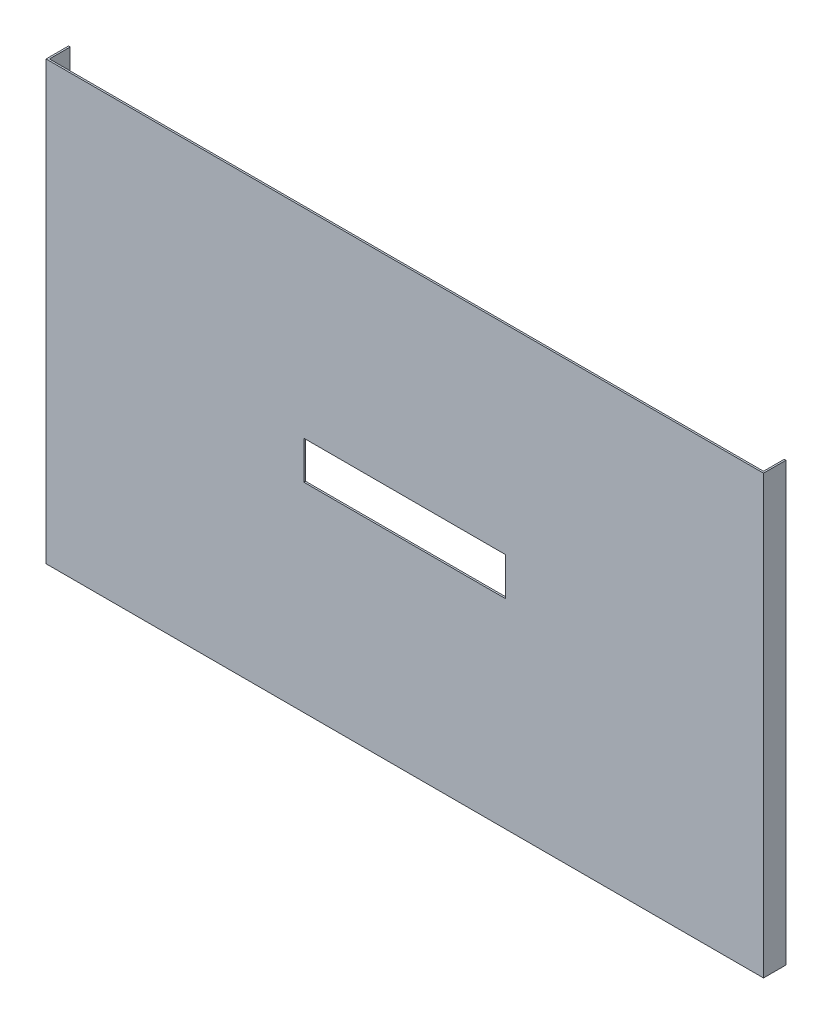
ISO-10303-21;
HEADER;
FILE_DESCRIPTION(('STEP AP214'),'2;1');
FILE_NAME('part.step','',(''),(''),'','','');
FILE_SCHEMA(('AUTOMOTIVE_DESIGN { 1 0 10303 214 1 1 1 1 }'));
ENDSEC;
DATA;
#1=APPLICATION_CONTEXT('core data for automotive mechanical design processes');
#2=APPLICATION_PROTOCOL_DEFINITION('international standard','automotive_design',2000,#1);
#3=PRODUCT_CONTEXT('',#1,'mechanical');
#4=PRODUCT('Part','Part','',(#3));
#5=PRODUCT_RELATED_PRODUCT_CATEGORY('part','',(#4));
#6=PRODUCT_DEFINITION_FORMATION('','',#4);
#7=PRODUCT_DEFINITION_CONTEXT('part definition',#1,'design');
#8=PRODUCT_DEFINITION('design','',#6,#7);
#9=PRODUCT_DEFINITION_SHAPE('','',#8);
#10=(LENGTH_UNIT() NAMED_UNIT(*) SI_UNIT(.MILLI.,.METRE.));
#11=(NAMED_UNIT(*) PLANE_ANGLE_UNIT() SI_UNIT($,.RADIAN.));
#12=(NAMED_UNIT(*) SI_UNIT($,.STERADIAN.) SOLID_ANGLE_UNIT());
#13=UNCERTAINTY_MEASURE_WITH_UNIT(LENGTH_MEASURE(1.E-05),#10,'distance_accuracy_value','');
#14=(GEOMETRIC_REPRESENTATION_CONTEXT(3) GLOBAL_UNCERTAINTY_ASSIGNED_CONTEXT((#13)) GLOBAL_UNIT_ASSIGNED_CONTEXT((#10,
#11,#12)) REPRESENTATION_CONTEXT('',''));
#15=CARTESIAN_POINT('',(0.,0.,0.));
#16=DIRECTION('',(0.,0.,1.));
#17=DIRECTION('',(1.,0.,0.));
#18=AXIS2_PLACEMENT_3D('',#15,#16,#17);
#19=CARTESIAN_POINT('',(670.,1950.,40.));
#20=DIRECTION('',(0.,0.,-1.));
#21=DIRECTION('',(-1.,0.,0.));
#22=AXIS2_PLACEMENT_3D('',#19,#20,#21);
#23=PLANE('',#22);
#24=DIRECTION('',(1.,0.,0.));
#25=VECTOR('',#24,1.);
#26=CARTESIAN_POINT('',(670.,1560.,40.));
#27=LINE('',#26,#25);
#28=CARTESIAN_POINT('',(30.,1560.,40.));
#29=VERTEX_POINT('',#28);
#30=CARTESIAN_POINT('',(670.,1560.,40.));
#31=VERTEX_POINT('',#30);
#32=EDGE_CURVE('E141',#29,#31,#27,.T.);
#33=ORIENTED_EDGE('',*,*,#32,.T.);
#34=DIRECTION('',(0.,-1.,0.));
#35=VECTOR('',#34,1.);
#36=CARTESIAN_POINT('',(670.,1950.,40.));
#37=LINE('',#36,#35);
#38=CARTESIAN_POINT('',(670.,1950.,40.));
#39=VERTEX_POINT('',#38);
#40=EDGE_CURVE('E200',#39,#31,#37,.T.);
#41=ORIENTED_EDGE('',*,*,#40,.F.);
#42=DIRECTION('',(1.,0.,0.));
#43=VECTOR('',#42,1.);
#44=CARTESIAN_POINT('',(670.,1950.,40.));
#45=LINE('',#44,#43);
#46=CARTESIAN_POINT('',(30.,1950.,40.));
#47=VERTEX_POINT('',#46);
#48=EDGE_CURVE('E149',#47,#39,#45,.T.);
#49=ORIENTED_EDGE('',*,*,#48,.F.);
#50=DIRECTION('',(0.,-1.,0.));
#51=VECTOR('',#50,1.);
#52=CARTESIAN_POINT('',(30.,1950.,40.));
#53=LINE('',#52,#51);
#54=EDGE_CURVE('E166',#47,#29,#53,.T.);
#55=ORIENTED_EDGE('',*,*,#54,.T.);
#56=EDGE_LOOP('',(#33,#41,#49,#55));
#57=FACE_BOUND('',#56,.T.);
#58=DIRECTION('',(0.,-1.,0.));
#59=VECTOR('',#58,1.);
#60=CARTESIAN_POINT('',(260.,1950.,40.));
#61=LINE('',#60,#59);
#62=CARTESIAN_POINT('',(260.,1772.,40.));
#63=VERTEX_POINT('',#62);
#64=CARTESIAN_POINT('',(260.,1738.,40.));
#65=VERTEX_POINT('',#64);
#66=EDGE_CURVE('E134',#63,#65,#61,.T.);
#67=ORIENTED_EDGE('',*,*,#66,.F.);
#68=DIRECTION('',(-1.,0.,0.));
#69=VECTOR('',#68,1.);
#70=CARTESIAN_POINT('',(670.,1772.,40.));
#71=LINE('',#70,#69);
#72=CARTESIAN_POINT('',(440.,1772.,40.));
#73=VERTEX_POINT('',#72);
#74=EDGE_CURVE('E123',#73,#63,#71,.T.);
#75=ORIENTED_EDGE('',*,*,#74,.F.);
#76=DIRECTION('',(0.,1.,0.));
#77=VECTOR('',#76,1.);
#78=CARTESIAN_POINT('',(440.,1950.,40.));
#79=LINE('',#78,#77);
#80=CARTESIAN_POINT('',(440.,1738.,40.));
#81=VERTEX_POINT('',#80);
#82=EDGE_CURVE('E128',#81,#73,#79,.T.);
#83=ORIENTED_EDGE('',*,*,#82,.F.);
#84=DIRECTION('',(1.,0.,0.));
#85=VECTOR('',#84,1.);
#86=CARTESIAN_POINT('',(670.,1738.,40.));
#87=LINE('',#86,#85);
#88=EDGE_CURVE('E140',#65,#81,#87,.T.);
#89=ORIENTED_EDGE('',*,*,#88,.F.);
#90=EDGE_LOOP('',(#67,#75,#83,#89));
#91=FACE_BOUND('',#90,.T.);
#92=ADVANCED_FACE('F39',(#57,#91),#23,.F.);
#93=CARTESIAN_POINT('',(31.5,1950.,38.5));
#94=DIRECTION('',(0.,0.,1.));
#95=DIRECTION('',(1.,0.,0.));
#96=AXIS2_PLACEMENT_3D('',#93,#94,#95);
#97=PLANE('',#96);
#98=DIRECTION('',(-1.,0.,0.));
#99=VECTOR('',#98,1.);
#100=CARTESIAN_POINT('',(31.5,1560.,38.5));
#101=LINE('',#100,#99);
#102=CARTESIAN_POINT('',(668.5,1560.,38.5));
#103=VERTEX_POINT('',#102);
#104=CARTESIAN_POINT('',(31.5,1560.,38.5));
#105=VERTEX_POINT('',#104);
#106=EDGE_CURVE('E173',#103,#105,#101,.T.);
#107=ORIENTED_EDGE('',*,*,#106,.T.);
#108=DIRECTION('',(0.,-1.,0.));
#109=VECTOR('',#108,1.);
#110=CARTESIAN_POINT('',(31.5,1950.,38.5));
#111=LINE('',#110,#109);
#112=CARTESIAN_POINT('',(31.5,1950.,38.5));
#113=VERTEX_POINT('',#112);
#114=EDGE_CURVE('E188',#113,#105,#111,.T.);
#115=ORIENTED_EDGE('',*,*,#114,.F.);
#116=DIRECTION('',(-1.,0.,0.));
#117=VECTOR('',#116,1.);
#118=CARTESIAN_POINT('',(31.5,1950.,38.5));
#119=LINE('',#118,#117);
#120=CARTESIAN_POINT('',(668.5,1950.,38.5));
#121=VERTEX_POINT('',#120);
#122=EDGE_CURVE('E159',#121,#113,#119,.T.);
#123=ORIENTED_EDGE('',*,*,#122,.F.);
#124=DIRECTION('',(0.,-1.,0.));
#125=VECTOR('',#124,1.);
#126=CARTESIAN_POINT('',(668.5,1950.,38.5));
#127=LINE('',#126,#125);
#128=EDGE_CURVE('E191',#121,#103,#127,.T.);
#129=ORIENTED_EDGE('',*,*,#128,.T.);
#130=EDGE_LOOP('',(#107,#115,#123,#129));
#131=FACE_BOUND('',#130,.T.);
#132=DIRECTION('',(0.,1.,0.));
#133=VECTOR('',#132,1.);
#134=CARTESIAN_POINT('',(260.,1950.,38.5));
#135=LINE('',#134,#133);
#136=CARTESIAN_POINT('',(260.,1738.,38.5));
#137=VERTEX_POINT('',#136);
#138=CARTESIAN_POINT('',(260.,1772.,38.5));
#139=VERTEX_POINT('',#138);
#140=EDGE_CURVE('E11',#137,#139,#135,.T.);
#141=ORIENTED_EDGE('',*,*,#140,.F.);
#142=DIRECTION('',(-1.,0.,0.));
#143=VECTOR('',#142,1.);
#144=CARTESIAN_POINT('',(31.5,1738.,38.5));
#145=LINE('',#144,#143);
#146=CARTESIAN_POINT('',(440.,1738.,38.5));
#147=VERTEX_POINT('',#146);
#148=EDGE_CURVE('E46',#147,#137,#145,.T.);
#149=ORIENTED_EDGE('',*,*,#148,.F.);
#150=DIRECTION('',(0.,-1.,0.));
#151=VECTOR('',#150,1.);
#152=CARTESIAN_POINT('',(440.,1950.,38.5));
#153=LINE('',#152,#151);
#154=CARTESIAN_POINT('',(440.,1772.,38.5));
#155=VERTEX_POINT('',#154);
#156=EDGE_CURVE('E205',#155,#147,#153,.T.);
#157=ORIENTED_EDGE('',*,*,#156,.F.);
#158=DIRECTION('',(1.,0.,0.));
#159=VECTOR('',#158,1.);
#160=CARTESIAN_POINT('',(31.5,1772.,38.5));
#161=LINE('',#160,#159);
#162=EDGE_CURVE('E203',#139,#155,#161,.T.);
#163=ORIENTED_EDGE('',*,*,#162,.F.);
#164=EDGE_LOOP('',(#141,#149,#157,#163));
#165=FACE_BOUND('',#164,.T.);
#166=ADVANCED_FACE('F215',(#131,#165),#97,.F.);
#167=CARTESIAN_POINT('',(670.,1950.,20.));
#168=DIRECTION('',(-1.,0.,0.));
#169=DIRECTION('',(0.,0.,1.));
#170=AXIS2_PLACEMENT_3D('',#167,#168,#169);
#171=PLANE('',#170);
#172=DIRECTION('',(0.,0.,-1.));
#173=VECTOR('',#172,1.);
#174=CARTESIAN_POINT('',(670.,1560.,20.));
#175=LINE('',#174,#173);
#176=CARTESIAN_POINT('',(670.,1560.,20.));
#177=VERTEX_POINT('',#176);
#178=EDGE_CURVE('E144',#31,#177,#175,.T.);
#179=ORIENTED_EDGE('',*,*,#178,.T.);
#180=DIRECTION('',(0.,-1.,0.));
#181=VECTOR('',#180,1.);
#182=CARTESIAN_POINT('',(670.,1950.,20.));
#183=LINE('',#182,#181);
#184=CARTESIAN_POINT('',(670.,1950.,20.));
#185=VERTEX_POINT('',#184);
#186=EDGE_CURVE('E197',#185,#177,#183,.T.);
#187=ORIENTED_EDGE('',*,*,#186,.F.);
#188=DIRECTION('',(0.,0.,-1.));
#189=VECTOR('',#188,1.);
#190=CARTESIAN_POINT('',(670.,1950.,20.));
#191=LINE('',#190,#189);
#192=EDGE_CURVE('E152',#39,#185,#191,.T.);
#193=ORIENTED_EDGE('',*,*,#192,.F.);
#194=ORIENTED_EDGE('',*,*,#40,.T.);
#195=EDGE_LOOP('',(#179,#187,#193,#194));
#196=FACE_BOUND('',#195,.T.);
#197=ADVANCED_FACE('F234',(#196),#171,.F.);
#198=CARTESIAN_POINT('',(668.5,1950.,20.));
#199=DIRECTION('',(0.,0.,1.));
#200=DIRECTION('',(1.,0.,0.));
#201=AXIS2_PLACEMENT_3D('',#198,#199,#200);
#202=PLANE('',#201);
#203=DIRECTION('',(-1.,0.,0.));
#204=VECTOR('',#203,1.);
#205=CARTESIAN_POINT('',(668.5,1560.,20.));
#206=LINE('',#205,#204);
#207=CARTESIAN_POINT('',(668.5,1560.,20.));
#208=VERTEX_POINT('',#207);
#209=EDGE_CURVE('E169',#177,#208,#206,.T.);
#210=ORIENTED_EDGE('',*,*,#209,.T.);
#211=DIRECTION('',(0.,-1.,0.));
#212=VECTOR('',#211,1.);
#213=CARTESIAN_POINT('',(668.5,1950.,20.));
#214=LINE('',#213,#212);
#215=CARTESIAN_POINT('',(668.5,1950.,20.));
#216=VERTEX_POINT('',#215);
#217=EDGE_CURVE('E194',#216,#208,#214,.T.);
#218=ORIENTED_EDGE('',*,*,#217,.F.);
#219=DIRECTION('',(-1.,0.,0.));
#220=VECTOR('',#219,1.);
#221=CARTESIAN_POINT('',(668.5,1950.,20.));
#222=LINE('',#221,#220);
#223=EDGE_CURVE('E155',#185,#216,#222,.T.);
#224=ORIENTED_EDGE('',*,*,#223,.F.);
#225=ORIENTED_EDGE('',*,*,#186,.T.);
#226=EDGE_LOOP('',(#210,#218,#224,#225));
#227=FACE_BOUND('',#226,.T.);
#228=ADVANCED_FACE('F273',(#227),#202,.F.);
#229=CARTESIAN_POINT('',(668.5,1950.,38.5));
#230=DIRECTION('',(1.,0.,0.));
#231=DIRECTION('',(0.,0.,-1.));
#232=AXIS2_PLACEMENT_3D('',#229,#230,#231);
#233=PLANE('',#232);
#234=DIRECTION('',(0.,0.,1.));
#235=VECTOR('',#234,1.);
#236=CARTESIAN_POINT('',(668.5,1560.,38.5));
#237=LINE('',#236,#235);
#238=EDGE_CURVE('E171',#208,#103,#237,.T.);
#239=ORIENTED_EDGE('',*,*,#238,.T.);
#240=ORIENTED_EDGE('',*,*,#128,.F.);
#241=DIRECTION('',(0.,0.,1.));
#242=VECTOR('',#241,1.);
#243=CARTESIAN_POINT('',(668.5,1950.,38.5));
#244=LINE('',#243,#242);
#245=EDGE_CURVE('E157',#216,#121,#244,.T.);
#246=ORIENTED_EDGE('',*,*,#245,.F.);
#247=ORIENTED_EDGE('',*,*,#217,.T.);
#248=EDGE_LOOP('',(#239,#240,#246,#247));
#249=FACE_BOUND('',#248,.T.);
#250=ADVANCED_FACE('F270',(#249),#233,.F.);
#251=CARTESIAN_POINT('',(31.5,1950.,20.));
#252=DIRECTION('',(-1.,0.,0.));
#253=DIRECTION('',(0.,0.,1.));
#254=AXIS2_PLACEMENT_3D('',#251,#252,#253);
#255=PLANE('',#254);
#256=DIRECTION('',(0.,0.,-1.));
#257=VECTOR('',#256,1.);
#258=CARTESIAN_POINT('',(31.5,1560.,20.));
#259=LINE('',#258,#257);
#260=CARTESIAN_POINT('',(31.5,1560.,20.));
#261=VERTEX_POINT('',#260);
#262=EDGE_CURVE('E175',#105,#261,#259,.T.);
#263=ORIENTED_EDGE('',*,*,#262,.T.);
#264=DIRECTION('',(0.,-1.,0.));
#265=VECTOR('',#264,1.);
#266=CARTESIAN_POINT('',(31.5,1950.,20.));
#267=LINE('',#266,#265);
#268=CARTESIAN_POINT('',(31.5,1950.,20.));
#269=VERTEX_POINT('',#268);
#270=EDGE_CURVE('E185',#269,#261,#267,.T.);
#271=ORIENTED_EDGE('',*,*,#270,.F.);
#272=DIRECTION('',(0.,0.,-1.));
#273=VECTOR('',#272,1.);
#274=CARTESIAN_POINT('',(31.5,1950.,20.));
#275=LINE('',#274,#273);
#276=EDGE_CURVE('E161',#113,#269,#275,.T.);
#277=ORIENTED_EDGE('',*,*,#276,.F.);
#278=ORIENTED_EDGE('',*,*,#114,.T.);
#279=EDGE_LOOP('',(#263,#271,#277,#278));
#280=FACE_BOUND('',#279,.T.);
#281=ADVANCED_FACE('F263',(#280),#255,.F.);
#282=CARTESIAN_POINT('',(30.,1950.,20.));
#283=DIRECTION('',(0.,0.,1.));
#284=DIRECTION('',(1.,0.,0.));
#285=AXIS2_PLACEMENT_3D('',#282,#283,#284);
#286=PLANE('',#285);
#287=DIRECTION('',(-1.,0.,0.));
#288=VECTOR('',#287,1.);
#289=CARTESIAN_POINT('',(30.,1560.,20.));
#290=LINE('',#289,#288);
#291=CARTESIAN_POINT('',(30.,1560.,20.));
#292=VERTEX_POINT('',#291);
#293=EDGE_CURVE('E177',#261,#292,#290,.T.);
#294=ORIENTED_EDGE('',*,*,#293,.T.);
#295=DIRECTION('',(0.,-1.,0.));
#296=VECTOR('',#295,1.);
#297=CARTESIAN_POINT('',(30.,1950.,20.));
#298=LINE('',#297,#296);
#299=CARTESIAN_POINT('',(30.,1950.,20.));
#300=VERTEX_POINT('',#299);
#301=EDGE_CURVE('E182',#300,#292,#298,.T.);
#302=ORIENTED_EDGE('',*,*,#301,.F.);
#303=DIRECTION('',(-1.,0.,0.));
#304=VECTOR('',#303,1.);
#305=CARTESIAN_POINT('',(30.,1950.,20.));
#306=LINE('',#305,#304);
#307=EDGE_CURVE('E163',#269,#300,#306,.T.);
#308=ORIENTED_EDGE('',*,*,#307,.F.);
#309=ORIENTED_EDGE('',*,*,#270,.T.);
#310=EDGE_LOOP('',(#294,#302,#308,#309));
#311=FACE_BOUND('',#310,.T.);
#312=ADVANCED_FACE('F258',(#311),#286,.F.);
#313=CARTESIAN_POINT('',(30.,1950.,40.));
#314=DIRECTION('',(1.,0.,0.));
#315=DIRECTION('',(0.,0.,-1.));
#316=AXIS2_PLACEMENT_3D('',#313,#314,#315);
#317=PLANE('',#316);
#318=DIRECTION('',(0.,0.,1.));
#319=VECTOR('',#318,1.);
#320=CARTESIAN_POINT('',(30.,1560.,40.));
#321=LINE('',#320,#319);
#322=EDGE_CURVE('E153',#292,#29,#321,.T.);
#323=ORIENTED_EDGE('',*,*,#322,.T.);
#324=ORIENTED_EDGE('',*,*,#54,.F.);
#325=DIRECTION('',(0.,0.,1.));
#326=VECTOR('',#325,1.);
#327=CARTESIAN_POINT('',(30.,1950.,40.));
#328=LINE('',#327,#326);
#329=EDGE_CURVE('E165',#300,#47,#328,.T.);
#330=ORIENTED_EDGE('',*,*,#329,.F.);
#331=ORIENTED_EDGE('',*,*,#301,.T.);
#332=EDGE_LOOP('',(#323,#324,#330,#331));
#333=FACE_BOUND('',#332,.T.);
#334=ADVANCED_FACE('F256',(#333),#317,.F.);
#335=CARTESIAN_POINT('',(0.,1950.,0.));
#336=DIRECTION('',(0.,-1.,0.));
#337=DIRECTION('',(0.,0.,-1.));
#338=AXIS2_PLACEMENT_3D('',#335,#336,#337);
#339=PLANE('',#338);
#340=ORIENTED_EDGE('',*,*,#48,.T.);
#341=ORIENTED_EDGE('',*,*,#192,.T.);
#342=ORIENTED_EDGE('',*,*,#223,.T.);
#343=ORIENTED_EDGE('',*,*,#245,.T.);
#344=ORIENTED_EDGE('',*,*,#122,.T.);
#345=ORIENTED_EDGE('',*,*,#276,.T.);
#346=ORIENTED_EDGE('',*,*,#307,.T.);
#347=ORIENTED_EDGE('',*,*,#329,.T.);
#348=EDGE_LOOP('',(#340,#341,#342,#343,#344,#345,#346,#347));
#349=FACE_BOUND('',#348,.T.);
#350=ADVANCED_FACE('F251',(#349),#339,.F.);
#351=CARTESIAN_POINT('',(0.,1560.,0.));
#352=DIRECTION('',(0.,-1.,0.));
#353=DIRECTION('',(0.,0.,-1.));
#354=AXIS2_PLACEMENT_3D('',#351,#352,#353);
#355=PLANE('',#354);
#356=ORIENTED_EDGE('',*,*,#32,.F.);
#357=ORIENTED_EDGE('',*,*,#322,.F.);
#358=ORIENTED_EDGE('',*,*,#293,.F.);
#359=ORIENTED_EDGE('',*,*,#262,.F.);
#360=ORIENTED_EDGE('',*,*,#106,.F.);
#361=ORIENTED_EDGE('',*,*,#238,.F.);
#362=ORIENTED_EDGE('',*,*,#209,.F.);
#363=ORIENTED_EDGE('',*,*,#178,.F.);
#364=EDGE_LOOP('',(#356,#357,#358,#359,#360,#361,#362,#363));
#365=FACE_BOUND('',#364,.T.);
#366=ADVANCED_FACE('F243',(#365),#355,.T.);
#367=CARTESIAN_POINT('',(260.,1738.,41.));
#368=DIRECTION('',(1.,0.,0.));
#369=DIRECTION('',(0.,0.,-1.));
#370=AXIS2_PLACEMENT_3D('',#367,#368,#369);
#371=PLANE('',#370);
#372=ORIENTED_EDGE('',*,*,#66,.T.);
#373=DIRECTION('',(0.,0.,-1.));
#374=VECTOR('',#373,1.);
#375=CARTESIAN_POINT('',(260.,1738.,41.));
#376=LINE('',#375,#374);
#377=EDGE_CURVE('E129',#65,#137,#376,.T.);
#378=ORIENTED_EDGE('',*,*,#377,.T.);
#379=ORIENTED_EDGE('',*,*,#140,.T.);
#380=DIRECTION('',(0.,0.,-1.));
#381=VECTOR('',#380,1.);
#382=CARTESIAN_POINT('',(260.,1772.,41.));
#383=LINE('',#382,#381);
#384=EDGE_CURVE('E58',#63,#139,#383,.T.);
#385=ORIENTED_EDGE('',*,*,#384,.F.);
#386=EDGE_LOOP('',(#372,#378,#379,#385));
#387=FACE_BOUND('',#386,.T.);
#388=ADVANCED_FACE('F132',(#387),#371,.T.);
#389=CARTESIAN_POINT('',(260.,1738.,41.));
#390=DIRECTION('',(0.,1.,0.));
#391=DIRECTION('',(0.,0.,1.));
#392=AXIS2_PLACEMENT_3D('',#389,#390,#391);
#393=PLANE('',#392);
#394=ORIENTED_EDGE('',*,*,#88,.T.);
#395=DIRECTION('',(0.,0.,-1.));
#396=VECTOR('',#395,1.);
#397=CARTESIAN_POINT('',(440.,1738.,41.));
#398=LINE('',#397,#396);
#399=EDGE_CURVE('E211',#81,#147,#398,.T.);
#400=ORIENTED_EDGE('',*,*,#399,.T.);
#401=ORIENTED_EDGE('',*,*,#148,.T.);
#402=ORIENTED_EDGE('',*,*,#377,.F.);
#403=EDGE_LOOP('',(#394,#400,#401,#402));
#404=FACE_BOUND('',#403,.T.);
#405=ADVANCED_FACE('F209',(#404),#393,.T.);
#406=CARTESIAN_POINT('',(440.,1738.,41.));
#407=DIRECTION('',(-1.,0.,0.));
#408=DIRECTION('',(0.,0.,1.));
#409=AXIS2_PLACEMENT_3D('',#406,#407,#408);
#410=PLANE('',#409);
#411=ORIENTED_EDGE('',*,*,#82,.T.);
#412=DIRECTION('',(0.,0.,-1.));
#413=VECTOR('',#412,1.);
#414=CARTESIAN_POINT('',(440.,1772.,41.));
#415=LINE('',#414,#413);
#416=EDGE_CURVE('E53',#73,#155,#415,.T.);
#417=ORIENTED_EDGE('',*,*,#416,.T.);
#418=ORIENTED_EDGE('',*,*,#156,.T.);
#419=ORIENTED_EDGE('',*,*,#399,.F.);
#420=EDGE_LOOP('',(#411,#417,#418,#419));
#421=FACE_BOUND('',#420,.T.);
#422=ADVANCED_FACE('F217',(#421),#410,.T.);
#423=CARTESIAN_POINT('',(260.,1772.,41.));
#424=DIRECTION('',(0.,-1.,0.));
#425=DIRECTION('',(0.,0.,-1.));
#426=AXIS2_PLACEMENT_3D('',#423,#424,#425);
#427=PLANE('',#426);
#428=ORIENTED_EDGE('',*,*,#74,.T.);
#429=ORIENTED_EDGE('',*,*,#384,.T.);
#430=ORIENTED_EDGE('',*,*,#162,.T.);
#431=ORIENTED_EDGE('',*,*,#416,.F.);
#432=EDGE_LOOP('',(#428,#429,#430,#431));
#433=FACE_BOUND('',#432,.T.);
#434=ADVANCED_FACE('F124',(#433),#427,.T.);
#435=CLOSED_SHELL('',(#92,#166,#197,#228,#250,#281,#312,#334,#350,#366,#388,#405,#422,#434));
#436=MANIFOLD_SOLID_BREP('B2',#435);
#437=ADVANCED_BREP_SHAPE_REPRESENTATION('',(#18,#436),#14);
#438=SHAPE_DEFINITION_REPRESENTATION(#9,#437);
ENDSEC;
END-ISO-10303-21;
